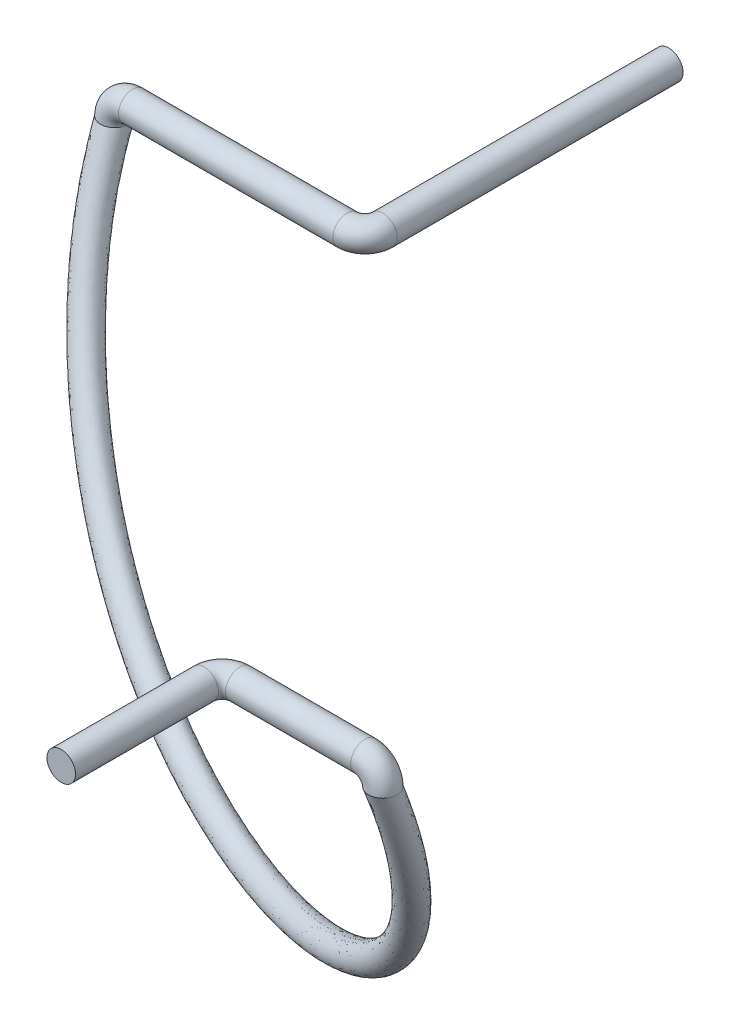
ISO-10303-21;
HEADER;
FILE_DESCRIPTION(('STEP AP214'),'2;1');
FILE_NAME('part.step','',(''),(''),'','','');
FILE_SCHEMA(('AUTOMOTIVE_DESIGN { 1 0 10303 214 1 1 1 1 }'));
ENDSEC;
DATA;
#1=APPLICATION_CONTEXT('core data for automotive mechanical design processes');
#2=APPLICATION_PROTOCOL_DEFINITION('international standard','automotive_design',2000,#1);
#3=PRODUCT_CONTEXT('',#1,'mechanical');
#4=PRODUCT('Part','Part','',(#3));
#5=PRODUCT_RELATED_PRODUCT_CATEGORY('part','',(#4));
#6=PRODUCT_DEFINITION_FORMATION('','',#4);
#7=PRODUCT_DEFINITION_CONTEXT('part definition',#1,'design');
#8=PRODUCT_DEFINITION('design','',#6,#7);
#9=PRODUCT_DEFINITION_SHAPE('','',#8);
#10=(LENGTH_UNIT() NAMED_UNIT(*) SI_UNIT(.MILLI.,.METRE.));
#11=(NAMED_UNIT(*) PLANE_ANGLE_UNIT() SI_UNIT($,.RADIAN.));
#12=(NAMED_UNIT(*) SI_UNIT($,.STERADIAN.) SOLID_ANGLE_UNIT());
#13=UNCERTAINTY_MEASURE_WITH_UNIT(LENGTH_MEASURE(1.E-05),#10,'distance_accuracy_value','');
#14=(GEOMETRIC_REPRESENTATION_CONTEXT(3) GLOBAL_UNCERTAINTY_ASSIGNED_CONTEXT((#13)) GLOBAL_UNIT_ASSIGNED_CONTEXT((#10,
#11,#12)) REPRESENTATION_CONTEXT('',''));
#15=CARTESIAN_POINT('',(0.,0.,0.));
#16=DIRECTION('',(0.,0.,1.));
#17=DIRECTION('',(1.,0.,0.));
#18=AXIS2_PLACEMENT_3D('',#15,#16,#17);
#19=CARTESIAN_POINT('',(-10.,0.,-12.1));
#20=CARTESIAN_POINT('',(-10.,-1.43778293994967,-11.5318181818182));
#21=CARTESIAN_POINT('',(-9.59492973614499,-2.81732556841423,-10.9636363636364));
#22=CARTESIAN_POINT('',(-9.18985947228998,-4.1968681968788,-10.3954545454545));
#23=CARTESIAN_POINT('',(-8.41253532831185,-5.40640817455592,-9.82727272727273));
#24=CARTESIAN_POINT('',(-7.63521118433372,-6.61594815223304,-9.25909090909091));
#25=CARTESIAN_POINT('',(-6.5486073394529,-7.55749574354254,-8.69090909090909));
#26=CARTESIAN_POINT('',(-5.46200349457208,-8.49904333485204,-8.12272727272727));
#27=CARTESIAN_POINT('',(-4.15415013001892,-9.09631995354516,-7.55454545454545));
#28=CARTESIAN_POINT('',(-2.84629676546577,-9.69359657223827,-6.98636363636364));
#29=CARTESIAN_POINT('',(-1.42314838273292,-9.89821441880932,-6.41818181818182));
#30=CARTESIAN_POINT('',(0.,-10.1028322653804,-5.85));
#31=CARTESIAN_POINT('',(1.42314838273279,-9.89821441880934,-5.28181818181818));
#32=CARTESIAN_POINT('',(2.84629676546564,-9.69359657223831,-4.71363636363636));
#33=CARTESIAN_POINT('',(4.1541501300188,-9.09631995354521,-4.14545454545454));
#34=CARTESIAN_POINT('',(5.46200349457197,-8.49904333485211,-3.57727272727273));
#35=CARTESIAN_POINT('',(6.5486073394528,-7.55749574354263,-3.00909090909091));
#36=CARTESIAN_POINT('',(7.63521118433363,-6.61594815223314,-2.44090909090909));
#37=CARTESIAN_POINT('',(8.41253532831178,-5.40640817455603,-1.87272727272727));
#38=CARTESIAN_POINT('',(9.18985947228992,-4.19686819687892,-1.30454545454545));
#39=CARTESIAN_POINT('',(9.59492973614495,-2.81732556841436,-0.736363636363634));
#40=CARTESIAN_POINT('',(9.99999999999999,-1.4377829399498,-0.168181818181816));
#41=CARTESIAN_POINT('',(10.,0.,0.400000000000003));
#42=CARTESIAN_POINT('',(-10.8,0.,-12.1));
#43=CARTESIAN_POINT('',(-10.8,-1.55280557514564,-11.5318181818182));
#44=CARTESIAN_POINT('',(-10.3625241150366,-3.04271161388737,-10.9636363636364));
#45=CARTESIAN_POINT('',(-9.92504823007317,-4.5326176526291,-10.3954545454545));
#46=CARTESIAN_POINT('',(-9.0855381545768,-5.83892082852039,-9.82727272727273));
#47=CARTESIAN_POINT('',(-8.24602807908041,-7.14522400441169,-9.25909090909091));
#48=CARTESIAN_POINT('',(-7.07249592660913,-8.16209540302594,-8.69090909090909));
#49=CARTESIAN_POINT('',(-5.89896377413785,-9.1789668016402,-8.12272727272727));
#50=CARTESIAN_POINT('',(-4.48648214042044,-9.82402554982877,-7.55454545454546));
#51=CARTESIAN_POINT('',(-3.07400050670303,-10.4690842980173,-6.98636363636364));
#52=CARTESIAN_POINT('',(-1.53700025335155,-10.6900715723141,-6.41818181818182));
#53=CARTESIAN_POINT('',(0.,-10.9110588466108,-5.85));
#54=CARTESIAN_POINT('',(1.53700025335141,-10.6900715723141,-5.28181818181818));
#55=CARTESIAN_POINT('',(3.07400050670289,-10.4690842980174,-4.71363636363636));
#56=CARTESIAN_POINT('',(4.48648214042031,-9.82402554982883,-4.14545454545455));
#57=CARTESIAN_POINT('',(5.89896377413773,-9.17896680164028,-3.57727272727273));
#58=CARTESIAN_POINT('',(7.07249592660902,-8.16209540302604,-3.00909090909091));
#59=CARTESIAN_POINT('',(8.24602807908032,-7.14522400441179,-2.44090909090909));
#60=CARTESIAN_POINT('',(9.08553815457672,-5.83892082852051,-1.87272727272727));
#61=CARTESIAN_POINT('',(9.92504823007311,-4.53261765262923,-1.30454545454545));
#62=CARTESIAN_POINT('',(10.3625241150366,-3.04271161388751,-0.736363636363636));
#63=CARTESIAN_POINT('',(10.8,-1.55280557514578,-0.168181818181817));
#64=CARTESIAN_POINT('',(10.8,0.,0.400000000000001));
#65=CARTESIAN_POINT('',(-10.8,0.,-12.9));
#66=CARTESIAN_POINT('',(-10.8,-1.55280557514564,-12.3318181818182));
#67=CARTESIAN_POINT('',(-10.3625241150366,-3.04271161388737,-11.7636363636364));
#68=CARTESIAN_POINT('',(-9.92504823007317,-4.5326176526291,-11.1954545454545));
#69=CARTESIAN_POINT('',(-9.0855381545768,-5.83892082852039,-10.6272727272727));
#70=CARTESIAN_POINT('',(-8.24602807908041,-7.14522400441169,-10.0590909090909));
#71=CARTESIAN_POINT('',(-7.07249592660913,-8.16209540302594,-9.49090909090909));
#72=CARTESIAN_POINT('',(-5.89896377413785,-9.1789668016402,-8.92272727272727));
#73=CARTESIAN_POINT('',(-4.48648214042044,-9.82402554982877,-8.35454545454545));
#74=CARTESIAN_POINT('',(-3.07400050670303,-10.4690842980173,-7.78636363636363));
#75=CARTESIAN_POINT('',(-1.53700025335155,-10.6900715723141,-7.21818181818182));
#76=CARTESIAN_POINT('',(0.,-10.9110588466108,-6.65));
#77=CARTESIAN_POINT('',(1.53700025335141,-10.6900715723141,-6.08181818181818));
#78=CARTESIAN_POINT('',(3.07400050670289,-10.4690842980174,-5.51363636363636));
#79=CARTESIAN_POINT('',(4.48648214042031,-9.82402554982883,-4.94545454545454));
#80=CARTESIAN_POINT('',(5.89896377413773,-9.17896680164028,-4.37727272727272));
#81=CARTESIAN_POINT('',(7.07249592660902,-8.16209540302604,-3.80909090909091));
#82=CARTESIAN_POINT('',(8.24602807908032,-7.14522400441179,-3.24090909090909));
#83=CARTESIAN_POINT('',(9.08553815457672,-5.83892082852051,-2.67272727272727));
#84=CARTESIAN_POINT('',(9.92504823007311,-4.53261765262923,-2.10454545454545));
#85=CARTESIAN_POINT('',(10.3625241150366,-3.04271161388751,-1.53636363636363));
#86=CARTESIAN_POINT('',(10.8,-1.55280557514578,-0.968181818181814));
#87=CARTESIAN_POINT('',(10.8,0.,-0.399999999999996));
#88=CARTESIAN_POINT('',(-10.,0.,-12.9));
#89=CARTESIAN_POINT('',(-10.,-1.43778293994967,-12.3318181818182));
#90=CARTESIAN_POINT('',(-9.59492973614499,-2.81732556841423,-11.7636363636364));
#91=CARTESIAN_POINT('',(-9.18985947228998,-4.1968681968788,-11.1954545454545));
#92=CARTESIAN_POINT('',(-8.41253532831185,-5.40640817455592,-10.6272727272727));
#93=CARTESIAN_POINT('',(-7.63521118433372,-6.61594815223304,-10.0590909090909));
#94=CARTESIAN_POINT('',(-6.5486073394529,-7.55749574354254,-9.49090909090909));
#95=CARTESIAN_POINT('',(-5.46200349457208,-8.49904333485204,-8.92272727272727));
#96=CARTESIAN_POINT('',(-4.15415013001892,-9.09631995354516,-8.35454545454545));
#97=CARTESIAN_POINT('',(-2.84629676546577,-9.69359657223827,-7.78636363636363));
#98=CARTESIAN_POINT('',(-1.42314838273292,-9.89821441880932,-7.21818181818182));
#99=CARTESIAN_POINT('',(0.,-10.1028322653804,-6.65));
#100=CARTESIAN_POINT('',(1.42314838273279,-9.89821441880934,-6.08181818181818));
#101=CARTESIAN_POINT('',(2.84629676546564,-9.69359657223831,-5.51363636363636));
#102=CARTESIAN_POINT('',(4.1541501300188,-9.09631995354521,-4.94545454545454));
#103=CARTESIAN_POINT('',(5.46200349457197,-8.49904333485211,-4.37727272727272));
#104=CARTESIAN_POINT('',(6.5486073394528,-7.55749574354263,-3.80909090909091));
#105=CARTESIAN_POINT('',(7.63521118433363,-6.61594815223314,-3.24090909090909));
#106=CARTESIAN_POINT('',(8.41253532831178,-5.40640817455603,-2.67272727272727));
#107=CARTESIAN_POINT('',(9.18985947228992,-4.19686819687892,-2.10454545454545));
#108=CARTESIAN_POINT('',(9.59492973614495,-2.81732556841436,-1.53636363636363));
#109=CARTESIAN_POINT('',(9.99999999999999,-1.4377829399498,-0.968181818181814));
#110=CARTESIAN_POINT('',(10.,0.,-0.399999999999996));
#111=CARTESIAN_POINT('',(-9.2,0.,-12.9));
#112=CARTESIAN_POINT('',(-9.20000000000001,-1.32276030475369,-12.3318181818182));
#113=CARTESIAN_POINT('',(-8.82733535725339,-2.5919395229411,-11.7636363636364));
#114=CARTESIAN_POINT('',(-8.45467071450678,-3.8611187411285,-11.1954545454545));
#115=CARTESIAN_POINT('',(-7.7395325020469,-4.97389552059145,-10.6272727272727));
#116=CARTESIAN_POINT('',(-7.02439428958702,-6.0866723000544,-10.0590909090909));
#117=CARTESIAN_POINT('',(-6.02471875229667,-6.95289608405914,-9.49090909090909));
#118=CARTESIAN_POINT('',(-5.02504321500632,-7.81911986806388,-8.92272727272727));
#119=CARTESIAN_POINT('',(-3.82181811961741,-8.36861435726155,-8.35454545454545));
#120=CARTESIAN_POINT('',(-2.61859302422851,-8.91810884645921,-7.78636363636363));
#121=CARTESIAN_POINT('',(-1.30929651211428,-9.10635726530457,-7.21818181818182));
#122=CARTESIAN_POINT('',(0.,-9.29460568414993,-6.65));
#123=CARTESIAN_POINT('',(1.30929651211416,-9.10635726530459,-6.08181818181818));
#124=CARTESIAN_POINT('',(2.61859302422839,-8.91810884645925,-5.51363636363636));
#125=CARTESIAN_POINT('',(3.8218181196173,-8.3686143572616,-4.94545454545454));
#126=CARTESIAN_POINT('',(5.02504321500621,-7.81911986806394,-4.37727272727272));
#127=CARTESIAN_POINT('',(6.02471875229658,-6.95289608405922,-3.80909090909091));
#128=CARTESIAN_POINT('',(7.02439428958694,-6.08667230005449,-3.24090909090909));
#129=CARTESIAN_POINT('',(7.73953250204684,-4.97389552059155,-2.67272727272727));
#130=CARTESIAN_POINT('',(8.45467071450673,-3.86111874112861,-2.10454545454545));
#131=CARTESIAN_POINT('',(8.82733535725336,-2.59193952294121,-1.53636363636363));
#132=CARTESIAN_POINT('',(9.19999999999999,-1.32276030475382,-0.968181818181814));
#133=CARTESIAN_POINT('',(9.2,0.,-0.399999999999996));
#134=CARTESIAN_POINT('',(-9.2,0.,-12.1));
#135=CARTESIAN_POINT('',(-9.20000000000001,-1.32276030475369,-11.5318181818182));
#136=CARTESIAN_POINT('',(-8.82733535725339,-2.5919395229411,-10.9636363636364));
#137=CARTESIAN_POINT('',(-8.45467071450678,-3.8611187411285,-10.3954545454545));
#138=CARTESIAN_POINT('',(-7.7395325020469,-4.97389552059145,-9.82727272727273));
#139=CARTESIAN_POINT('',(-7.02439428958702,-6.0866723000544,-9.25909090909091));
#140=CARTESIAN_POINT('',(-6.02471875229667,-6.95289608405914,-8.69090909090909));
#141=CARTESIAN_POINT('',(-5.02504321500632,-7.81911986806388,-8.12272727272727));
#142=CARTESIAN_POINT('',(-3.82181811961741,-8.36861435726155,-7.55454545454546));
#143=CARTESIAN_POINT('',(-2.61859302422851,-8.91810884645921,-6.98636363636364));
#144=CARTESIAN_POINT('',(-1.30929651211428,-9.10635726530457,-6.41818181818182));
#145=CARTESIAN_POINT('',(0.,-9.29460568414993,-5.85));
#146=CARTESIAN_POINT('',(1.30929651211416,-9.10635726530459,-5.28181818181818));
#147=CARTESIAN_POINT('',(2.61859302422839,-8.91810884645925,-4.71363636363636));
#148=CARTESIAN_POINT('',(3.8218181196173,-8.3686143572616,-4.14545454545455));
#149=CARTESIAN_POINT('',(5.02504321500621,-7.81911986806394,-3.57727272727273));
#150=CARTESIAN_POINT('',(6.02471875229658,-6.95289608405922,-3.00909090909091));
#151=CARTESIAN_POINT('',(7.02439428958694,-6.08667230005449,-2.44090909090909));
#152=CARTESIAN_POINT('',(7.73953250204684,-4.97389552059155,-1.87272727272727));
#153=CARTESIAN_POINT('',(8.45467071450673,-3.86111874112861,-1.30454545454545));
#154=CARTESIAN_POINT('',(8.82733535725336,-2.59193952294121,-0.736363636363636));
#155=CARTESIAN_POINT('',(9.19999999999999,-1.32276030475382,-0.168181818181817));
#156=CARTESIAN_POINT('',(9.2,0.,0.400000000000001));
#157=CARTESIAN_POINT('',(-10.,0.,-12.1));
#158=CARTESIAN_POINT('',(-10.,-1.43778293994967,-11.5318181818182));
#159=CARTESIAN_POINT('',(-9.59492973614499,-2.81732556841423,-10.9636363636364));
#160=CARTESIAN_POINT('',(-9.18985947228998,-4.1968681968788,-10.3954545454545));
#161=CARTESIAN_POINT('',(-8.41253532831185,-5.40640817455592,-9.82727272727273));
#162=CARTESIAN_POINT('',(-7.63521118433372,-6.61594815223304,-9.25909090909091));
#163=CARTESIAN_POINT('',(-6.5486073394529,-7.55749574354254,-8.69090909090909));
#164=CARTESIAN_POINT('',(-5.46200349457208,-8.49904333485204,-8.12272727272727));
#165=CARTESIAN_POINT('',(-4.15415013001892,-9.09631995354516,-7.55454545454545));
#166=CARTESIAN_POINT('',(-2.84629676546577,-9.69359657223827,-6.98636363636364));
#167=CARTESIAN_POINT('',(-1.42314838273292,-9.89821441880932,-6.41818181818182));
#168=CARTESIAN_POINT('',(0.,-10.1028322653804,-5.85));
#169=CARTESIAN_POINT('',(1.42314838273279,-9.89821441880934,-5.28181818181818));
#170=CARTESIAN_POINT('',(2.84629676546564,-9.69359657223831,-4.71363636363636));
#171=CARTESIAN_POINT('',(4.1541501300188,-9.09631995354521,-4.14545454545454));
#172=CARTESIAN_POINT('',(5.46200349457197,-8.49904333485211,-3.57727272727273));
#173=CARTESIAN_POINT('',(6.5486073394528,-7.55749574354263,-3.00909090909091));
#174=CARTESIAN_POINT('',(7.63521118433363,-6.61594815223314,-2.44090909090909));
#175=CARTESIAN_POINT('',(8.41253532831178,-5.40640817455603,-1.87272727272727));
#176=CARTESIAN_POINT('',(9.18985947228992,-4.19686819687892,-1.30454545454545));
#177=CARTESIAN_POINT('',(9.59492973614495,-2.81732556841436,-0.736363636363634));
#178=CARTESIAN_POINT('',(9.99999999999999,-1.4377829399498,-0.168181818181816));
#179=CARTESIAN_POINT('',(10.,0.,0.400000000000003));
#180=(BOUNDED_SURFACE() B_SPLINE_SURFACE(3,2,((#19,#20,#21,#22,#23,#24,#25,#26,#27,#28,#29,#30,
#31,#32,#33,#34,#35,#36,#37,#38,#39,#40,#41),(#42,#43,#44,#45,#46,#47,#48,#49,#50,#51,#52,#53,
#54,#55,#56,#57,#58,#59,#60,#61,#62,#63,#64),(#65,#66,#67,#68,#69,#70,#71,#72,#73,#74,#75,#76,
#77,#78,#79,#80,#81,#82,#83,#84,#85,#86,#87),(#88,#89,#90,#91,#92,#93,#94,#95,#96,#97,#98,#99,
#100,#101,#102,#103,#104,#105,#106,#107,#108,#109,#110),(#111,#112,#113,#114,#115,#116,#117,
#118,#119,#120,#121,#122,#123,#124,#125,#126,#127,#128,#129,#130,#131,#132,#133),(#134,#135,
#136,#137,#138,#139,#140,#141,#142,#143,#144,#145,#146,#147,#148,#149,#150,#151,#152,#153,#154,
#155,#156),(#157,#158,#159,#160,#161,#162,#163,#164,#165,#166,#167,#168,#169,#170,#171,#172,
#173,#174,#175,#176,#177,#178,#179)),.UNSPECIFIED.,.T.,.F.,.F.) B_SPLINE_SURFACE_WITH_KNOTS((4,
3,4),(3,2,2,2,2,2,2,2,2,2,2,3),(0.,0.5,1.),(0.,0.0454545454545455,0.0909090909090909,
0.136363636363636,0.181818181818182,0.227272727272727,0.272727272727273,0.318181818181818,
0.363636363636364,0.409090909090909,0.454545454545455,0.5),
.UNSPECIFIED.) GEOMETRIC_REPRESENTATION_ITEM() RATIONAL_B_SPLINE_SURFACE(((1.,0.989821441880933,
1.,0.989821441880933,1.,0.989821441880933,1.,0.989821441880933,1.,0.989821441880933,1.,
0.989821441880933,1.,0.989821441880933,1.,0.989821441880933,1.,0.989821441880933,1.,
0.989821441880933,1.,0.989821441880933,1.),(0.333333333333333,0.329940480626978,
0.333333333333333,0.329940480626978,0.333333333333333,0.329940480626978,0.333333333333333,
0.329940480626978,0.333333333333333,0.329940480626978,0.333333333333333,0.329940480626978,
0.333333333333333,0.329940480626978,0.333333333333333,0.329940480626978,0.333333333333333,
0.329940480626978,0.333333333333333,0.329940480626978,0.333333333333333,0.329940480626978,
0.333333333333333),(0.333333333333333,0.329940480626978,0.333333333333333,0.329940480626978,
0.333333333333333,0.329940480626978,0.333333333333333,0.329940480626978,0.333333333333333,
0.329940480626978,0.333333333333333,0.329940480626978,0.333333333333333,0.329940480626978,
0.333333333333333,0.329940480626978,0.333333333333333,0.329940480626978,0.333333333333333,
0.329940480626978,0.333333333333333,0.329940480626978,0.333333333333333),(1.,0.989821441880933,
1.,0.989821441880933,1.,0.989821441880933,1.,0.989821441880933,1.,0.989821441880933,1.,
0.989821441880933,1.,0.989821441880933,1.,0.989821441880933,1.,0.989821441880933,1.,
0.989821441880933,1.,0.989821441880933,1.),(0.333333333333333,0.329940480626978,
0.333333333333333,0.329940480626978,0.333333333333333,0.329940480626978,0.333333333333333,
0.329940480626978,0.333333333333333,0.329940480626978,0.333333333333333,0.329940480626978,
0.333333333333333,0.329940480626978,0.333333333333333,0.329940480626978,0.333333333333333,
0.329940480626978,0.333333333333333,0.329940480626978,0.333333333333333,0.329940480626978,
0.333333333333333),(0.333333333333333,0.329940480626978,0.333333333333333,0.329940480626978,
0.333333333333333,0.329940480626978,0.333333333333333,0.329940480626978,0.333333333333333,
0.329940480626978,0.333333333333333,0.329940480626978,0.333333333333333,0.329940480626978,
0.333333333333333,0.329940480626978,0.333333333333333,0.329940480626978,0.333333333333333,
0.329940480626978,0.333333333333333,0.329940480626978,0.333333333333333),(1.,0.989821441880933,
1.,0.989821441880933,1.,0.989821441880933,1.,0.989821441880933,1.,0.989821441880933,1.,
0.989821441880933,1.,0.989821441880933,1.,0.989821441880933,1.,0.989821441880933,1.,
0.989821441880933,1.,0.989821441880933,1.))) REPRESENTATION_ITEM('') SURFACE());
#181=CARTESIAN_POINT('',(-10.,0.,-12.5));
#182=DIRECTION('',(0.,-1.,0.));
#183=DIRECTION('',(1.,0.,0.));
#184=AXIS2_PLACEMENT_3D('',#181,#182,#183);
#185=CIRCLE('',#184,0.399999999999999);
#186=CARTESIAN_POINT('',(-10.4,1.17689925246659E-13,-12.5));
#187=VERTEX_POINT('',#186);
#188=EDGE_CURVE('E45',#187,#187,#185,.T.);
#189=CARTESIAN_POINT('',(10.,0.,0.));
#190=DIRECTION('',(0.,-1.,0.));
#191=DIRECTION('',(1.,0.,0.));
#192=AXIS2_PLACEMENT_3D('',#189,#190,#191);
#193=CIRCLE('',#192,0.399999999999999);
#194=CARTESIAN_POINT('',(10.4,-1.19904086659517E-13,0.));
#195=VERTEX_POINT('',#194);
#196=EDGE_CURVE('E12',#195,#195,#193,.T.);
#197=ORIENTED_EDGE('',*,*,#188,.T.);
#198=EDGE_LOOP('',(#197));
#199=FACE_BOUND('',#198,.T.);
#200=ORIENTED_EDGE('',*,*,#196,.T.);
#201=EDGE_LOOP('',(#200));
#202=FACE_BOUND('',#201,.T.);
#203=ADVANCED_FACE('F40',(#199,#202),#180,.T.);
#204=CARTESIAN_POINT('',(9.5,0.,0.));
#205=DIRECTION('',(0.,0.,1.));
#206=DIRECTION('',(1.,0.,0.));
#207=AXIS2_PLACEMENT_3D('',#204,#205,#206);
#208=TOROIDAL_SURFACE('',#207,0.5,0.399999999999999);
#209=CARTESIAN_POINT('',(9.50000000000007,0.5,0.));
#210=DIRECTION('',(1.,0.,0.));
#211=DIRECTION('',(0.,1.,0.));
#212=AXIS2_PLACEMENT_3D('',#209,#210,#211);
#213=CIRCLE('',#212,0.399999999999999);
#214=CARTESIAN_POINT('',(9.50000000000012,0.9,0.));
#215=VERTEX_POINT('',#214);
#216=EDGE_CURVE('E76',#215,#215,#213,.T.);
#217=CARTESIAN_POINT('',(9.5,0.,0.));
#218=DIRECTION('',(0.,0.,1.));
#219=DIRECTION('',(1.,0.,0.));
#220=AXIS2_PLACEMENT_3D('',#217,#218,#219);
#221=CIRCLE('',#220,0.9);
#222=EDGE_CURVE('',#195,#215,#221,.T.);
#223=ORIENTED_EDGE('',*,*,#196,.F.);
#224=ORIENTED_EDGE('',*,*,#216,.T.);
#225=ORIENTED_EDGE('',*,*,#222,.T.);
#226=ORIENTED_EDGE('',*,*,#222,.F.);
#227=EDGE_LOOP('',(#223,#225,#224,#226));
#228=FACE_BOUND('',#227,.T.);
#229=ADVANCED_FACE('F105',(#228),#208,.T.);
#230=CARTESIAN_POINT('',(9.50000000000007,0.5,0.));
#231=DIRECTION('',(-1.,0.,0.));
#232=DIRECTION('',(0.,-1.,0.));
#233=AXIS2_PLACEMENT_3D('',#230,#231,#232);
#234=CYLINDRICAL_SURFACE('',#233,0.399999999999999);
#235=CARTESIAN_POINT('',(6.00000000000007,0.5,0.));
#236=DIRECTION('',(1.,0.,0.));
#237=DIRECTION('',(0.,1.,0.));
#238=AXIS2_PLACEMENT_3D('',#235,#236,#237);
#239=CIRCLE('',#238,0.399999999999999);
#240=CARTESIAN_POINT('',(6.00000000000012,0.5,-0.4));
#241=VERTEX_POINT('',#240);
#242=EDGE_CURVE('E79',#241,#241,#239,.T.);
#243=ORIENTED_EDGE('',*,*,#242,.T.);
#244=EDGE_LOOP('',(#243));
#245=FACE_BOUND('',#244,.T.);
#246=ORIENTED_EDGE('',*,*,#216,.F.);
#247=EDGE_LOOP('',(#246));
#248=FACE_BOUND('',#247,.T.);
#249=ADVANCED_FACE('F112',(#245,#248),#234,.T.);
#250=CARTESIAN_POINT('',(5.5,0.500000000000001,4.5));
#251=DIRECTION('',(1.24683249835833E-13,0.,1.));
#252=DIRECTION('',(0.,-1.,0.));
#253=AXIS2_PLACEMENT_3D('',#250,#251,#252);
#254=PLANE('',#253);
#255=CARTESIAN_POINT('',(5.5,0.500000000000001,4.5));
#256=DIRECTION('',(1.24683249835833E-13,0.,1.));
#257=DIRECTION('',(0.,-1.,0.));
#258=AXIS2_PLACEMENT_3D('',#255,#256,#257);
#259=CIRCLE('',#258,0.4);
#260=CARTESIAN_POINT('',(5.5,0.100000000000001,4.5));
#261=VERTEX_POINT('',#260);
#262=EDGE_CURVE('E54',#261,#261,#259,.T.);
#263=ORIENTED_EDGE('',*,*,#262,.T.);
#264=EDGE_LOOP('',(#263));
#265=FACE_BOUND('',#264,.T.);
#266=ADVANCED_FACE('F101',(#265),#254,.T.);
#267=CARTESIAN_POINT('',(6.,0.500000000000001,0.5));
#268=DIRECTION('',(0.,1.,0.));
#269=DIRECTION('',(0.,0.,1.));
#270=AXIS2_PLACEMENT_3D('',#267,#268,#269);
#271=TOROIDAL_SURFACE('',#270,0.5,0.4);
#272=CARTESIAN_POINT('',(5.5,0.500000000000001,0.5));
#273=DIRECTION('',(1.24683249835833E-13,0.,1.));
#274=DIRECTION('',(0.,-1.,0.));
#275=AXIS2_PLACEMENT_3D('',#272,#273,#274);
#276=CIRCLE('',#275,0.4);
#277=CARTESIAN_POINT('',(5.1,0.500000000000001,0.5));
#278=VERTEX_POINT('',#277);
#279=EDGE_CURVE('E72',#278,#278,#276,.T.);
#280=CARTESIAN_POINT('',(6.,0.500000000000001,0.5));
#281=DIRECTION('',(0.,1.,0.));
#282=DIRECTION('',(0.,0.,1.));
#283=AXIS2_PLACEMENT_3D('',#280,#281,#282);
#284=CIRCLE('',#283,0.9);
#285=EDGE_CURVE('',#241,#278,#284,.T.);
#286=ORIENTED_EDGE('',*,*,#242,.F.);
#287=ORIENTED_EDGE('',*,*,#279,.F.);
#288=ORIENTED_EDGE('',*,*,#285,.T.);
#289=ORIENTED_EDGE('',*,*,#285,.F.);
#290=EDGE_LOOP('',(#286,#288,#287,#289));
#291=FACE_BOUND('',#290,.T.);
#292=ADVANCED_FACE('F102',(#291),#271,.T.);
#293=CARTESIAN_POINT('',(5.5,0.500000000000001,0.5));
#294=DIRECTION('',(0.,0.,1.));
#295=DIRECTION('',(1.,0.,0.));
#296=AXIS2_PLACEMENT_3D('',#293,#294,#295);
#297=CYLINDRICAL_SURFACE('',#296,0.4);
#298=ORIENTED_EDGE('',*,*,#262,.F.);
#299=EDGE_LOOP('',(#298));
#300=FACE_BOUND('',#299,.T.);
#301=ORIENTED_EDGE('',*,*,#279,.T.);
#302=EDGE_LOOP('',(#301));
#303=FACE_BOUND('',#302,.T.);
#304=ADVANCED_FACE('F91',(#300,#303),#297,.T.);
#305=CARTESIAN_POINT('',(-9.5,0.,-12.5));
#306=DIRECTION('',(0.,0.,-1.));
#307=DIRECTION('',(-1.,0.,0.));
#308=AXIS2_PLACEMENT_3D('',#305,#306,#307);
#309=TOROIDAL_SURFACE('',#308,0.500000000000002,0.399999999999999);
#310=CARTESIAN_POINT('',(-9.49999999999993,0.500000000000002,-12.5));
#311=DIRECTION('',(1.,0.,0.));
#312=DIRECTION('',(0.,1.,0.));
#313=AXIS2_PLACEMENT_3D('',#310,#311,#312);
#314=CIRCLE('',#313,0.399999999999999);
#315=CARTESIAN_POINT('',(-9.49999999999988,0.900000000000001,-12.5));
#316=VERTEX_POINT('',#315);
#317=EDGE_CURVE('E61',#316,#316,#314,.T.);
#318=CARTESIAN_POINT('',(-9.5,0.,-12.5));
#319=DIRECTION('',(0.,0.,-1.));
#320=DIRECTION('',(-1.,0.,0.));
#321=AXIS2_PLACEMENT_3D('',#318,#319,#320);
#322=CIRCLE('',#321,0.900000000000001);
#323=EDGE_CURVE('',#187,#316,#322,.T.);
#324=ORIENTED_EDGE('',*,*,#188,.F.);
#325=ORIENTED_EDGE('',*,*,#317,.F.);
#326=ORIENTED_EDGE('',*,*,#323,.T.);
#327=ORIENTED_EDGE('',*,*,#323,.F.);
#328=EDGE_LOOP('',(#324,#326,#325,#327));
#329=FACE_BOUND('',#328,.T.);
#330=ADVANCED_FACE('F88',(#329),#309,.T.);
#331=CARTESIAN_POINT('',(-9.49999999999993,0.500000000000002,-12.5));
#332=DIRECTION('',(1.,0.,0.));
#333=DIRECTION('',(0.,0.,-1.));
#334=AXIS2_PLACEMENT_3D('',#331,#332,#333);
#335=CYLINDRICAL_SURFACE('',#334,0.399999999999999);
#336=CARTESIAN_POINT('',(-3.49999999999993,0.500000000000002,-12.5));
#337=DIRECTION('',(1.,0.,0.));
#338=DIRECTION('',(0.,1.,0.));
#339=AXIS2_PLACEMENT_3D('',#336,#337,#338);
#340=CIRCLE('',#339,0.399999999999999);
#341=CARTESIAN_POINT('',(-3.49999999999993,0.500000000000036,-12.1));
#342=VERTEX_POINT('',#341);
#343=EDGE_CURVE('E65',#342,#342,#340,.T.);
#344=ORIENTED_EDGE('',*,*,#343,.F.);
#345=EDGE_LOOP('',(#344));
#346=FACE_BOUND('',#345,.T.);
#347=ORIENTED_EDGE('',*,*,#317,.T.);
#348=EDGE_LOOP('',(#347));
#349=FACE_BOUND('',#348,.T.);
#350=ADVANCED_FACE('F90',(#346,#349),#335,.T.);
#351=CARTESIAN_POINT('',(-2.99999999999993,0.49999999999996,-21.));
#352=DIRECTION('',(0.,0.,-1.));
#353=DIRECTION('',(0.,1.,0.));
#354=AXIS2_PLACEMENT_3D('',#351,#352,#353);
#355=PLANE('',#354);
#356=CARTESIAN_POINT('',(-2.99999999999993,0.49999999999996,-21.));
#357=DIRECTION('',(0.,0.,-1.));
#358=DIRECTION('',(0.,1.,0.));
#359=AXIS2_PLACEMENT_3D('',#356,#357,#358);
#360=CIRCLE('',#359,0.4);
#361=CARTESIAN_POINT('',(-2.99999999999993,0.89999999999996,-21.));
#362=VERTEX_POINT('',#361);
#363=EDGE_CURVE('E58',#362,#362,#360,.T.);
#364=ORIENTED_EDGE('',*,*,#363,.T.);
#365=EDGE_LOOP('',(#364));
#366=FACE_BOUND('',#365,.T.);
#367=ADVANCED_FACE('F59',(#366),#355,.T.);
#368=CARTESIAN_POINT('',(-3.49999999999993,0.49999999999996,-13.));
#369=DIRECTION('',(0.,1.,0.));
#370=DIRECTION('',(0.,0.,1.));
#371=AXIS2_PLACEMENT_3D('',#368,#369,#370);
#372=TOROIDAL_SURFACE('',#371,0.5,0.4);
#373=CARTESIAN_POINT('',(-2.99999999999993,0.49999999999996,-13.));
#374=DIRECTION('',(0.,0.,-1.));
#375=DIRECTION('',(0.,1.,0.));
#376=AXIS2_PLACEMENT_3D('',#373,#374,#375);
#377=CIRCLE('',#376,0.4);
#378=CARTESIAN_POINT('',(-2.59999999999993,0.49999999999996,-13.));
#379=VERTEX_POINT('',#378);
#380=EDGE_CURVE('E62',#379,#379,#377,.T.);
#381=CARTESIAN_POINT('',(-3.49999999999993,0.49999999999996,-13.));
#382=DIRECTION('',(0.,1.,0.));
#383=DIRECTION('',(0.,0.,1.));
#384=AXIS2_PLACEMENT_3D('',#381,#382,#383);
#385=CIRCLE('',#384,0.9);
#386=EDGE_CURVE('',#342,#379,#385,.T.);
#387=ORIENTED_EDGE('',*,*,#343,.T.);
#388=ORIENTED_EDGE('',*,*,#380,.F.);
#389=ORIENTED_EDGE('',*,*,#386,.T.);
#390=ORIENTED_EDGE('',*,*,#386,.F.);
#391=EDGE_LOOP('',(#387,#389,#388,#390));
#392=FACE_BOUND('',#391,.T.);
#393=ADVANCED_FACE('F109',(#392),#372,.T.);
#394=CARTESIAN_POINT('',(-2.99999999999993,0.49999999999996,-13.));
#395=DIRECTION('',(0.,0.,-1.));
#396=DIRECTION('',(-1.,0.,0.));
#397=AXIS2_PLACEMENT_3D('',#394,#395,#396);
#398=CYLINDRICAL_SURFACE('',#397,0.4);
#399=ORIENTED_EDGE('',*,*,#363,.F.);
#400=EDGE_LOOP('',(#399));
#401=FACE_BOUND('',#400,.T.);
#402=ORIENTED_EDGE('',*,*,#380,.T.);
#403=EDGE_LOOP('',(#402));
#404=FACE_BOUND('',#403,.T.);
#405=ADVANCED_FACE('F94',(#401,#404),#398,.T.);
#406=CLOSED_SHELL('',(#203,#229,#249,#266,#292,#304,#330,#350,#367,#393,#405));
#407=MANIFOLD_SOLID_BREP('B2',#406);
#408=ADVANCED_BREP_SHAPE_REPRESENTATION('',(#18,#407),#14);
#409=SHAPE_DEFINITION_REPRESENTATION(#9,#408);
ENDSEC;
END-ISO-10303-21;
